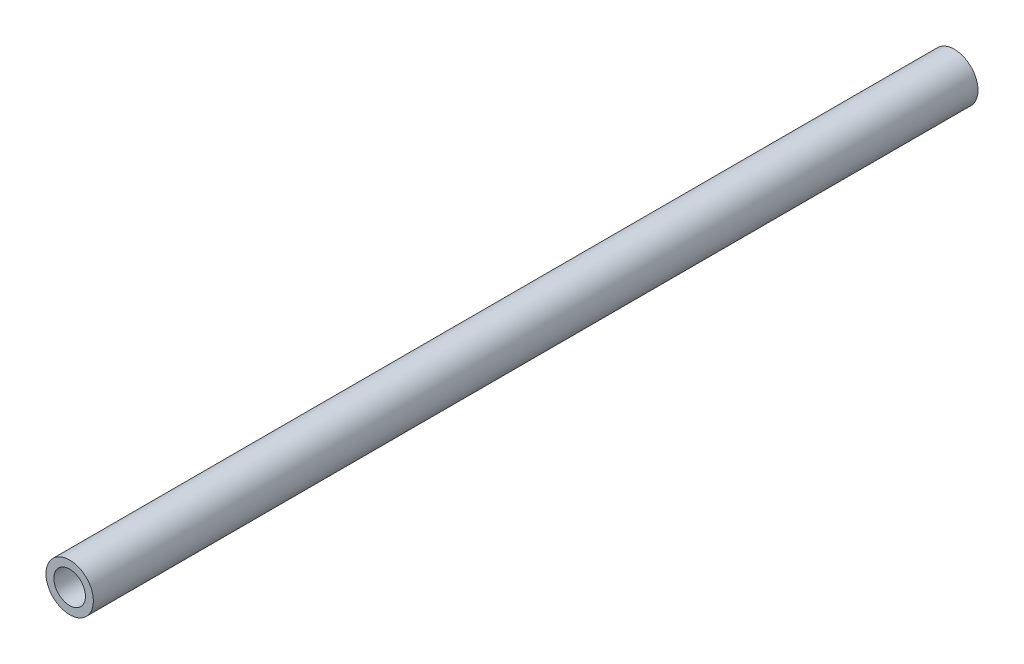
ISO-10303-21;
HEADER;
FILE_DESCRIPTION(('STEP AP214'),'2;1');
FILE_NAME('part.step','',(''),(''),'','','');
FILE_SCHEMA(('AUTOMOTIVE_DESIGN { 1 0 10303 214 1 1 1 1 }'));
ENDSEC;
DATA;
#1=APPLICATION_CONTEXT('core data for automotive mechanical design processes');
#2=APPLICATION_PROTOCOL_DEFINITION('international standard','automotive_design',2000,#1);
#3=PRODUCT_CONTEXT('',#1,'mechanical');
#4=PRODUCT('Part','Part','',(#3));
#5=PRODUCT_RELATED_PRODUCT_CATEGORY('part','',(#4));
#6=PRODUCT_DEFINITION_FORMATION('','',#4);
#7=PRODUCT_DEFINITION_CONTEXT('part definition',#1,'design');
#8=PRODUCT_DEFINITION('design','',#6,#7);
#9=PRODUCT_DEFINITION_SHAPE('','',#8);
#10=(LENGTH_UNIT() NAMED_UNIT(*) SI_UNIT(.MILLI.,.METRE.));
#11=(NAMED_UNIT(*) PLANE_ANGLE_UNIT() SI_UNIT($,.RADIAN.));
#12=(NAMED_UNIT(*) SI_UNIT($,.STERADIAN.) SOLID_ANGLE_UNIT());
#13=UNCERTAINTY_MEASURE_WITH_UNIT(LENGTH_MEASURE(1.E-05),#10,'distance_accuracy_value','');
#14=(GEOMETRIC_REPRESENTATION_CONTEXT(3) GLOBAL_UNCERTAINTY_ASSIGNED_CONTEXT((#13)) GLOBAL_UNIT_ASSIGNED_CONTEXT((#10,
#11,#12)) REPRESENTATION_CONTEXT('',''));
#15=CARTESIAN_POINT('',(0.,0.,0.));
#16=DIRECTION('',(0.,0.,1.));
#17=DIRECTION('',(1.,0.,0.));
#18=AXIS2_PLACEMENT_3D('',#15,#16,#17);
#19=CARTESIAN_POINT('',(0.,0.,280.));
#20=DIRECTION('',(0.,0.,1.));
#21=DIRECTION('',(1.,0.,0.));
#22=AXIS2_PLACEMENT_3D('',#19,#20,#21);
#23=PLANE('',#22);
#24=CARTESIAN_POINT('',(0.,0.,280.));
#25=DIRECTION('',(0.,0.,1.));
#26=DIRECTION('',(1.,0.,0.));
#27=AXIS2_PLACEMENT_3D('',#24,#25,#26);
#28=CIRCLE('',#27,7.5);
#29=CARTESIAN_POINT('',(7.5,0.,280.));
#30=VERTEX_POINT('',#29);
#31=EDGE_CURVE('E10',#30,#30,#28,.T.);
#32=ORIENTED_EDGE('',*,*,#31,.T.);
#33=EDGE_LOOP('',(#32));
#34=FACE_BOUND('',#33,.T.);
#35=CARTESIAN_POINT('',(0.,0.,280.));
#36=DIRECTION('',(0.,0.,1.));
#37=DIRECTION('',(1.,0.,0.));
#38=AXIS2_PLACEMENT_3D('',#35,#36,#37);
#39=CIRCLE('',#38,5.);
#40=CARTESIAN_POINT('',(5.,0.,280.));
#41=VERTEX_POINT('',#40);
#42=EDGE_CURVE('E48',#41,#41,#39,.T.);
#43=ORIENTED_EDGE('',*,*,#42,.F.);
#44=EDGE_LOOP('',(#43));
#45=FACE_BOUND('',#44,.T.);
#46=ADVANCED_FACE('F37',(#34,#45),#23,.T.);
#47=CARTESIAN_POINT('',(0.,0.,0.));
#48=DIRECTION('',(0.,0.,1.));
#49=DIRECTION('',(1.,0.,0.));
#50=AXIS2_PLACEMENT_3D('',#47,#48,#49);
#51=PLANE('',#50);
#52=CARTESIAN_POINT('',(0.,0.,0.));
#53=DIRECTION('',(0.,0.,1.));
#54=DIRECTION('',(1.,0.,0.));
#55=AXIS2_PLACEMENT_3D('',#52,#53,#54);
#56=CIRCLE('',#55,7.5);
#57=CARTESIAN_POINT('',(7.5,0.,0.));
#58=VERTEX_POINT('',#57);
#59=EDGE_CURVE('E41',#58,#58,#56,.T.);
#60=ORIENTED_EDGE('',*,*,#59,.F.);
#61=EDGE_LOOP('',(#60));
#62=FACE_BOUND('',#61,.T.);
#63=CARTESIAN_POINT('',(0.,0.,0.));
#64=DIRECTION('',(0.,0.,1.));
#65=DIRECTION('',(1.,0.,0.));
#66=AXIS2_PLACEMENT_3D('',#63,#64,#65);
#67=CIRCLE('',#66,5.);
#68=CARTESIAN_POINT('',(5.,0.,0.));
#69=VERTEX_POINT('',#68);
#70=EDGE_CURVE('E50',#69,#69,#67,.T.);
#71=ORIENTED_EDGE('',*,*,#70,.T.);
#72=EDGE_LOOP('',(#71));
#73=FACE_BOUND('',#72,.T.);
#74=ADVANCED_FACE('F60',(#62,#73),#51,.F.);
#75=CARTESIAN_POINT('',(0.,0.,280.));
#76=DIRECTION('',(0.,0.,-1.));
#77=DIRECTION('',(-1.,0.,0.));
#78=AXIS2_PLACEMENT_3D('',#75,#76,#77);
#79=CYLINDRICAL_SURFACE('',#78,7.5);
#80=ORIENTED_EDGE('',*,*,#31,.F.);
#81=EDGE_LOOP('',(#80));
#82=FACE_BOUND('',#81,.T.);
#83=ORIENTED_EDGE('',*,*,#59,.T.);
#84=EDGE_LOOP('',(#83));
#85=FACE_BOUND('',#84,.T.);
#86=ADVANCED_FACE('F39',(#82,#85),#79,.T.);
#87=CARTESIAN_POINT('',(0.,0.,280.));
#88=DIRECTION('',(0.,0.,-1.));
#89=DIRECTION('',(-1.,0.,0.));
#90=AXIS2_PLACEMENT_3D('',#87,#88,#89);
#91=CYLINDRICAL_SURFACE('',#90,5.);
#92=ORIENTED_EDGE('',*,*,#42,.T.);
#93=EDGE_LOOP('',(#92));
#94=FACE_BOUND('',#93,.T.);
#95=ORIENTED_EDGE('',*,*,#70,.F.);
#96=EDGE_LOOP('',(#95));
#97=FACE_BOUND('',#96,.T.);
#98=ADVANCED_FACE('F56',(#94,#97),#91,.F.);
#99=CLOSED_SHELL('',(#46,#74,#86,#98));
#100=MANIFOLD_SOLID_BREP('B2',#99);
#101=ADVANCED_BREP_SHAPE_REPRESENTATION('',(#18,#100),#14);
#102=SHAPE_DEFINITION_REPRESENTATION(#9,#101);
ENDSEC;
END-ISO-10303-21;
